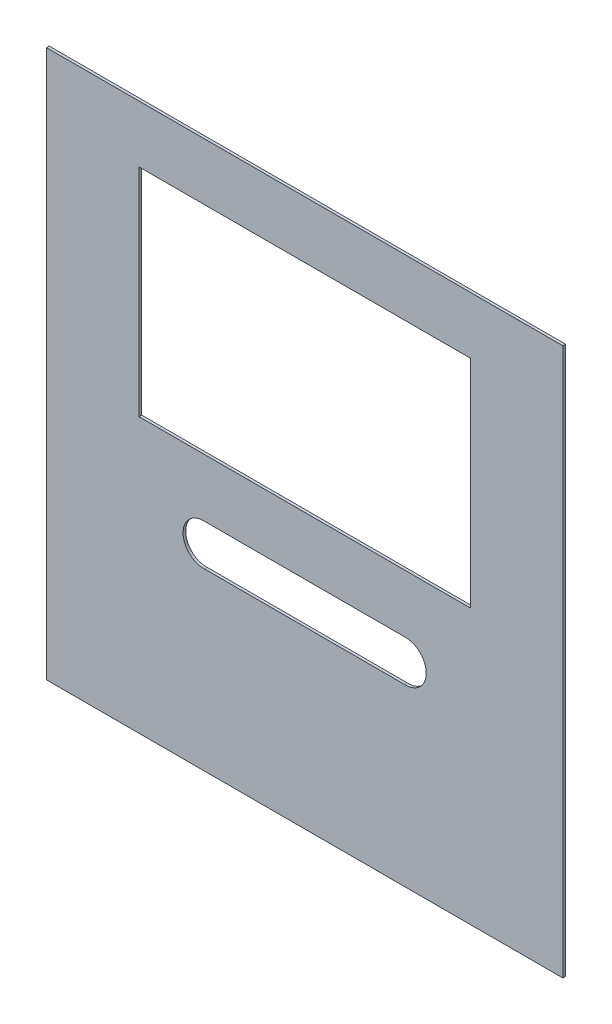
ISO-10303-21;
HEADER;
FILE_DESCRIPTION(('STEP AP214'),'2;1');
FILE_NAME('part.step','',(''),(''),'','','');
FILE_SCHEMA(('AUTOMOTIVE_DESIGN { 1 0 10303 214 1 1 1 1 }'));
ENDSEC;
DATA;
#1=APPLICATION_CONTEXT('core data for automotive mechanical design processes');
#2=APPLICATION_PROTOCOL_DEFINITION('international standard','automotive_design',2000,#1);
#3=PRODUCT_CONTEXT('',#1,'mechanical');
#4=PRODUCT('Part','Part','',(#3));
#5=PRODUCT_RELATED_PRODUCT_CATEGORY('part','',(#4));
#6=PRODUCT_DEFINITION_FORMATION('','',#4);
#7=PRODUCT_DEFINITION_CONTEXT('part definition',#1,'design');
#8=PRODUCT_DEFINITION('design','',#6,#7);
#9=PRODUCT_DEFINITION_SHAPE('','',#8);
#10=(LENGTH_UNIT() NAMED_UNIT(*) SI_UNIT(.MILLI.,.METRE.));
#11=(NAMED_UNIT(*) PLANE_ANGLE_UNIT() SI_UNIT($,.RADIAN.));
#12=(NAMED_UNIT(*) SI_UNIT($,.STERADIAN.) SOLID_ANGLE_UNIT());
#13=UNCERTAINTY_MEASURE_WITH_UNIT(LENGTH_MEASURE(1.E-05),#10,'distance_accuracy_value','');
#14=(GEOMETRIC_REPRESENTATION_CONTEXT(3) GLOBAL_UNCERTAINTY_ASSIGNED_CONTEXT((#13)) GLOBAL_UNIT_ASSIGNED_CONTEXT((#10,
#11,#12)) REPRESENTATION_CONTEXT('',''));
#15=CARTESIAN_POINT('',(0.,0.,0.));
#16=DIRECTION('',(0.,0.,1.));
#17=DIRECTION('',(1.,0.,0.));
#18=AXIS2_PLACEMENT_3D('',#15,#16,#17);
#19=CARTESIAN_POINT('',(0.,0.,0.));
#20=DIRECTION('',(0.,0.,-1.));
#21=DIRECTION('',(-1.,0.,0.));
#22=AXIS2_PLACEMENT_3D('',#19,#20,#21);
#23=PLANE('',#22);
#24=CARTESIAN_POINT('',(74.6725591611366,-35.25,0.));
#25=DIRECTION('',(0.,0.,-1.));
#26=DIRECTION('',(1.,0.,0.));
#27=AXIS2_PLACEMENT_3D('',#24,#25,#26);
#28=CIRCLE('',#27,15.2733808570862);
#29=CARTESIAN_POINT('',(73.8277735045313,-20.,0.));
#30=VERTEX_POINT('',#29);
#31=CARTESIAN_POINT('',(73.8277735045313,-50.5,0.));
#32=VERTEX_POINT('',#31);
#33=EDGE_CURVE('E57',#30,#32,#28,.T.);
#34=ORIENTED_EDGE('',*,*,#33,.F.);
#35=DIRECTION('',(1.,0.,0.));
#36=VECTOR('',#35,1.);
#37=CARTESIAN_POINT('',(73.8277735045313,-20.,0.));
#38=LINE('',#37,#36);
#39=CARTESIAN_POINT('',(-73.8277735045313,-20.,0.));
#40=VERTEX_POINT('',#39);
#41=EDGE_CURVE('E151',#40,#30,#38,.T.);
#42=ORIENTED_EDGE('',*,*,#41,.F.);
#43=CARTESIAN_POINT('',(-74.6725591611366,-35.25,0.));
#44=DIRECTION('',(0.,0.,-1.));
#45=DIRECTION('',(-1.,0.,0.));
#46=AXIS2_PLACEMENT_3D('',#43,#44,#45);
#47=CIRCLE('',#46,15.2733808570862);
#48=CARTESIAN_POINT('',(-73.8277735045313,-50.5,0.));
#49=VERTEX_POINT('',#48);
#50=EDGE_CURVE('E155',#49,#40,#47,.T.);
#51=ORIENTED_EDGE('',*,*,#50,.F.);
#52=DIRECTION('',(-1.,0.,0.));
#53=VECTOR('',#52,1.);
#54=CARTESIAN_POINT('',(73.8277735045313,-50.5,0.));
#55=LINE('',#54,#53);
#56=EDGE_CURVE('E164',#32,#49,#55,.T.);
#57=ORIENTED_EDGE('',*,*,#56,.F.);
#58=EDGE_LOOP('',(#34,#42,#51,#57));
#59=FACE_BOUND('',#58,.T.);
#60=DIRECTION('',(0.,-1.,0.));
#61=VECTOR('',#60,1.);
#62=CARTESIAN_POINT('',(191.,225.,0.));
#63=LINE('',#62,#61);
#64=CARTESIAN_POINT('',(191.,225.,0.));
#65=VERTEX_POINT('',#64);
#66=CARTESIAN_POINT('',(191.,-180.,0.));
#67=VERTEX_POINT('',#66);
#68=EDGE_CURVE('E249',#65,#67,#63,.T.);
#69=ORIENTED_EDGE('',*,*,#68,.T.);
#70=DIRECTION('',(-1.,0.,0.));
#71=VECTOR('',#70,1.);
#72=CARTESIAN_POINT('',(191.,-180.,0.));
#73=LINE('',#72,#71);
#74=CARTESIAN_POINT('',(-191.,-180.,0.));
#75=VERTEX_POINT('',#74);
#76=EDGE_CURVE('E230',#67,#75,#73,.T.);
#77=ORIENTED_EDGE('',*,*,#76,.T.);
#78=DIRECTION('',(0.,1.,0.));
#79=VECTOR('',#78,1.);
#80=CARTESIAN_POINT('',(-191.,-180.,0.));
#81=LINE('',#80,#79);
#82=CARTESIAN_POINT('',(-191.,225.,0.));
#83=VERTEX_POINT('',#82);
#84=EDGE_CURVE('E213',#75,#83,#81,.T.);
#85=ORIENTED_EDGE('',*,*,#84,.T.);
#86=DIRECTION('',(1.,0.,0.));
#87=VECTOR('',#86,1.);
#88=CARTESIAN_POINT('',(-191.,225.,0.));
#89=LINE('',#88,#87);
#90=EDGE_CURVE('E245',#83,#65,#89,.T.);
#91=ORIENTED_EDGE('',*,*,#90,.T.);
#92=EDGE_LOOP('',(#69,#77,#85,#91));
#93=FACE_BOUND('',#92,.T.);
#94=DIRECTION('',(1.,0.,0.));
#95=VECTOR('',#94,1.);
#96=CARTESIAN_POINT('',(-122.5,182.814505171212,0.));
#97=LINE('',#96,#95);
#98=CARTESIAN_POINT('',(-122.5,182.814505171212,0.));
#99=VERTEX_POINT('',#98);
#100=CARTESIAN_POINT('',(122.5,182.814505171212,0.));
#101=VERTEX_POINT('',#100);
#102=EDGE_CURVE('E181',#99,#101,#97,.T.);
#103=ORIENTED_EDGE('',*,*,#102,.F.);
#104=DIRECTION('',(0.,1.,0.));
#105=VECTOR('',#104,1.);
#106=CARTESIAN_POINT('',(-122.5,22.8145051712123,0.));
#107=LINE('',#106,#105);
#108=CARTESIAN_POINT('',(-122.5,22.8145051712123,0.));
#109=VERTEX_POINT('',#108);
#110=EDGE_CURVE('E187',#109,#99,#107,.T.);
#111=ORIENTED_EDGE('',*,*,#110,.F.);
#112=DIRECTION('',(-1.,0.,0.));
#113=VECTOR('',#112,1.);
#114=CARTESIAN_POINT('',(131.110849861601,22.8145051712123,0.));
#115=LINE('',#114,#113);
#116=CARTESIAN_POINT('',(122.5,22.8145051712123,0.));
#117=VERTEX_POINT('',#116);
#118=EDGE_CURVE('E173',#117,#109,#115,.T.);
#119=ORIENTED_EDGE('',*,*,#118,.F.);
#120=DIRECTION('',(0.,-1.,0.));
#121=VECTOR('',#120,1.);
#122=CARTESIAN_POINT('',(122.5,182.814505171212,0.));
#123=LINE('',#122,#121);
#124=EDGE_CURVE('E203',#101,#117,#123,.T.);
#125=ORIENTED_EDGE('',*,*,#124,.F.);
#126=EDGE_LOOP('',(#103,#111,#119,#125));
#127=FACE_BOUND('',#126,.T.);
#128=ADVANCED_FACE('F39',(#59,#93,#127),#23,.T.);
#129=CARTESIAN_POINT('',(-191.,-180.,2.));
#130=DIRECTION('',(-1.,0.,0.));
#131=DIRECTION('',(0.,0.,1.));
#132=AXIS2_PLACEMENT_3D('',#129,#130,#131);
#133=PLANE('',#132);
#134=ORIENTED_EDGE('',*,*,#84,.F.);
#135=DIRECTION('',(0.,0.,-1.));
#136=VECTOR('',#135,1.);
#137=CARTESIAN_POINT('',(-191.,-180.,2.));
#138=LINE('',#137,#136);
#139=CARTESIAN_POINT('',(-191.,-180.,2.));
#140=VERTEX_POINT('',#139);
#141=EDGE_CURVE('E11',#140,#75,#138,.T.);
#142=ORIENTED_EDGE('',*,*,#141,.F.);
#143=DIRECTION('',(0.,1.,0.));
#144=VECTOR('',#143,1.);
#145=CARTESIAN_POINT('',(-191.,-180.,2.));
#146=LINE('',#145,#144);
#147=CARTESIAN_POINT('',(-191.,225.,2.));
#148=VERTEX_POINT('',#147);
#149=EDGE_CURVE('E225',#140,#148,#146,.T.);
#150=ORIENTED_EDGE('',*,*,#149,.T.);
#151=DIRECTION('',(0.,0.,-1.));
#152=VECTOR('',#151,1.);
#153=CARTESIAN_POINT('',(-191.,225.,2.));
#154=LINE('',#153,#152);
#155=EDGE_CURVE('E43',#148,#83,#154,.T.);
#156=ORIENTED_EDGE('',*,*,#155,.T.);
#157=EDGE_LOOP('',(#134,#142,#150,#156));
#158=FACE_BOUND('',#157,.T.);
#159=ADVANCED_FACE('F41',(#158),#133,.T.);
#160=CARTESIAN_POINT('',(191.,-180.,2.));
#161=DIRECTION('',(0.,-1.,0.));
#162=DIRECTION('',(0.,0.,-1.));
#163=AXIS2_PLACEMENT_3D('',#160,#161,#162);
#164=PLANE('',#163);
#165=ORIENTED_EDGE('',*,*,#76,.F.);
#166=DIRECTION('',(0.,0.,-1.));
#167=VECTOR('',#166,1.);
#168=CARTESIAN_POINT('',(191.,-180.,2.));
#169=LINE('',#168,#167);
#170=CARTESIAN_POINT('',(191.,-180.,2.));
#171=VERTEX_POINT('',#170);
#172=EDGE_CURVE('E49',#171,#67,#169,.T.);
#173=ORIENTED_EDGE('',*,*,#172,.F.);
#174=DIRECTION('',(-1.,0.,0.));
#175=VECTOR('',#174,1.);
#176=CARTESIAN_POINT('',(191.,-180.,2.));
#177=LINE('',#176,#175);
#178=EDGE_CURVE('E238',#171,#140,#177,.T.);
#179=ORIENTED_EDGE('',*,*,#178,.T.);
#180=ORIENTED_EDGE('',*,*,#141,.T.);
#181=EDGE_LOOP('',(#165,#173,#179,#180));
#182=FACE_BOUND('',#181,.T.);
#183=ADVANCED_FACE('F272',(#182),#164,.T.);
#184=CARTESIAN_POINT('',(191.,225.,2.));
#185=DIRECTION('',(1.,0.,0.));
#186=DIRECTION('',(0.,0.,-1.));
#187=AXIS2_PLACEMENT_3D('',#184,#185,#186);
#188=PLANE('',#187);
#189=ORIENTED_EDGE('',*,*,#68,.F.);
#190=DIRECTION('',(0.,0.,-1.));
#191=VECTOR('',#190,1.);
#192=CARTESIAN_POINT('',(191.,225.,2.));
#193=LINE('',#192,#191);
#194=CARTESIAN_POINT('',(191.,225.,2.));
#195=VERTEX_POINT('',#194);
#196=EDGE_CURVE('E257',#195,#65,#193,.T.);
#197=ORIENTED_EDGE('',*,*,#196,.F.);
#198=DIRECTION('',(0.,-1.,0.));
#199=VECTOR('',#198,1.);
#200=CARTESIAN_POINT('',(191.,225.,2.));
#201=LINE('',#200,#199);
#202=EDGE_CURVE('E234',#195,#171,#201,.T.);
#203=ORIENTED_EDGE('',*,*,#202,.T.);
#204=ORIENTED_EDGE('',*,*,#172,.T.);
#205=EDGE_LOOP('',(#189,#197,#203,#204));
#206=FACE_BOUND('',#205,.T.);
#207=ADVANCED_FACE('F277',(#206),#188,.T.);
#208=CARTESIAN_POINT('',(-191.,225.,2.));
#209=DIRECTION('',(0.,1.,0.));
#210=DIRECTION('',(0.,0.,1.));
#211=AXIS2_PLACEMENT_3D('',#208,#209,#210);
#212=PLANE('',#211);
#213=ORIENTED_EDGE('',*,*,#90,.F.);
#214=ORIENTED_EDGE('',*,*,#155,.F.);
#215=DIRECTION('',(1.,0.,0.));
#216=VECTOR('',#215,1.);
#217=CARTESIAN_POINT('',(-191.,225.,2.));
#218=LINE('',#217,#216);
#219=EDGE_CURVE('E229',#148,#195,#218,.T.);
#220=ORIENTED_EDGE('',*,*,#219,.T.);
#221=ORIENTED_EDGE('',*,*,#196,.T.);
#222=EDGE_LOOP('',(#213,#214,#220,#221));
#223=FACE_BOUND('',#222,.T.);
#224=ADVANCED_FACE('F267',(#223),#212,.T.);
#225=CARTESIAN_POINT('',(0.,0.,2.));
#226=DIRECTION('',(0.,0.,-1.));
#227=DIRECTION('',(-1.,0.,0.));
#228=AXIS2_PLACEMENT_3D('',#225,#226,#227);
#229=PLANE('',#228);
#230=DIRECTION('',(1.,0.,0.));
#231=VECTOR('',#230,1.);
#232=CARTESIAN_POINT('',(73.8277735045313,-20.,2.));
#233=LINE('',#232,#231);
#234=CARTESIAN_POINT('',(-73.8277735045313,-20.,2.));
#235=VERTEX_POINT('',#234);
#236=CARTESIAN_POINT('',(73.8277735045313,-20.,2.));
#237=VERTEX_POINT('',#236);
#238=EDGE_CURVE('E139',#235,#237,#233,.T.);
#239=ORIENTED_EDGE('',*,*,#238,.T.);
#240=CARTESIAN_POINT('',(74.6725591611366,-35.25,2.));
#241=DIRECTION('',(0.,0.,-1.));
#242=DIRECTION('',(1.,0.,0.));
#243=AXIS2_PLACEMENT_3D('',#240,#241,#242);
#244=CIRCLE('',#243,15.2733808570862);
#245=CARTESIAN_POINT('',(73.8277735045313,-50.5,2.));
#246=VERTEX_POINT('',#245);
#247=EDGE_CURVE('E132',#237,#246,#244,.T.);
#248=ORIENTED_EDGE('',*,*,#247,.T.);
#249=DIRECTION('',(-1.,0.,0.));
#250=VECTOR('',#249,1.);
#251=CARTESIAN_POINT('',(73.8277735045313,-50.5,2.));
#252=LINE('',#251,#250);
#253=CARTESIAN_POINT('',(-73.8277735045313,-50.5,2.));
#254=VERTEX_POINT('',#253);
#255=EDGE_CURVE('E142',#246,#254,#252,.T.);
#256=ORIENTED_EDGE('',*,*,#255,.T.);
#257=CARTESIAN_POINT('',(-74.6725591611366,-35.25,2.));
#258=DIRECTION('',(0.,0.,-1.));
#259=DIRECTION('',(-1.,0.,0.));
#260=AXIS2_PLACEMENT_3D('',#257,#258,#259);
#261=CIRCLE('',#260,15.2733808570862);
#262=EDGE_CURVE('E65',#254,#235,#261,.T.);
#263=ORIENTED_EDGE('',*,*,#262,.T.);
#264=EDGE_LOOP('',(#239,#248,#256,#263));
#265=FACE_BOUND('',#264,.T.);
#266=DIRECTION('',(0.,1.,0.));
#267=VECTOR('',#266,1.);
#268=CARTESIAN_POINT('',(-122.5,22.8145051712123,2.));
#269=LINE('',#268,#267);
#270=CARTESIAN_POINT('',(-122.5,22.8145051712123,2.));
#271=VERTEX_POINT('',#270);
#272=CARTESIAN_POINT('',(-122.5,182.814505171212,2.));
#273=VERTEX_POINT('',#272);
#274=EDGE_CURVE('E195',#271,#273,#269,.T.);
#275=ORIENTED_EDGE('',*,*,#274,.T.);
#276=DIRECTION('',(1.,0.,0.));
#277=VECTOR('',#276,1.);
#278=CARTESIAN_POINT('',(-122.5,182.814505171212,2.));
#279=LINE('',#278,#277);
#280=CARTESIAN_POINT('',(122.5,182.814505171212,2.));
#281=VERTEX_POINT('',#280);
#282=EDGE_CURVE('E182',#273,#281,#279,.T.);
#283=ORIENTED_EDGE('',*,*,#282,.T.);
#284=DIRECTION('',(0.,-1.,0.));
#285=VECTOR('',#284,1.);
#286=CARTESIAN_POINT('',(122.5,182.814505171212,2.));
#287=LINE('',#286,#285);
#288=CARTESIAN_POINT('',(122.5,22.8145051712123,2.));
#289=VERTEX_POINT('',#288);
#290=EDGE_CURVE('E186',#281,#289,#287,.T.);
#291=ORIENTED_EDGE('',*,*,#290,.T.);
#292=DIRECTION('',(-1.,0.,0.));
#293=VECTOR('',#292,1.);
#294=CARTESIAN_POINT('',(122.5,22.8145051712123,2.));
#295=LINE('',#294,#293);
#296=EDGE_CURVE('E191',#289,#271,#295,.T.);
#297=ORIENTED_EDGE('',*,*,#296,.T.);
#298=EDGE_LOOP('',(#275,#283,#291,#297));
#299=FACE_BOUND('',#298,.T.);
#300=ORIENTED_EDGE('',*,*,#149,.F.);
#301=ORIENTED_EDGE('',*,*,#178,.F.);
#302=ORIENTED_EDGE('',*,*,#202,.F.);
#303=ORIENTED_EDGE('',*,*,#219,.F.);
#304=EDGE_LOOP('',(#300,#301,#302,#303));
#305=FACE_BOUND('',#304,.T.);
#306=ADVANCED_FACE('F147',(#265,#299,#305),#229,.F.);
#307=CARTESIAN_POINT('',(131.110849861601,22.8145051712123,0.));
#308=DIRECTION('',(0.,-1.,0.));
#309=DIRECTION('',(0.,0.,-1.));
#310=AXIS2_PLACEMENT_3D('',#307,#308,#309);
#311=PLANE('',#310);
#312=DIRECTION('',(0.,0.,-1.));
#313=VECTOR('',#312,1.);
#314=CARTESIAN_POINT('',(122.5,22.8145051712123,2.));
#315=LINE('',#314,#313);
#316=EDGE_CURVE('E218',#289,#117,#315,.T.);
#317=ORIENTED_EDGE('',*,*,#316,.T.);
#318=ORIENTED_EDGE('',*,*,#118,.T.);
#319=DIRECTION('',(0.,0.,-1.));
#320=VECTOR('',#319,1.);
#321=CARTESIAN_POINT('',(-122.5,22.8145051712123,2.));
#322=LINE('',#321,#320);
#323=EDGE_CURVE('E214',#271,#109,#322,.T.);
#324=ORIENTED_EDGE('',*,*,#323,.F.);
#325=ORIENTED_EDGE('',*,*,#296,.F.);
#326=EDGE_LOOP('',(#317,#318,#324,#325));
#327=FACE_BOUND('',#326,.T.);
#328=ADVANCED_FACE('F294',(#327),#311,.F.);
#329=CARTESIAN_POINT('',(-122.5,182.814505171212,2.));
#330=DIRECTION('',(0.,1.,0.));
#331=DIRECTION('',(-1.,0.,0.));
#332=AXIS2_PLACEMENT_3D('',#329,#330,#331);
#333=PLANE('',#332);
#334=ORIENTED_EDGE('',*,*,#102,.T.);
#335=DIRECTION('',(0.,0.,-1.));
#336=VECTOR('',#335,1.);
#337=CARTESIAN_POINT('',(122.5,182.814505171212,2.));
#338=LINE('',#337,#336);
#339=EDGE_CURVE('E199',#281,#101,#338,.T.);
#340=ORIENTED_EDGE('',*,*,#339,.F.);
#341=ORIENTED_EDGE('',*,*,#282,.F.);
#342=DIRECTION('',(0.,0.,-1.));
#343=VECTOR('',#342,1.);
#344=CARTESIAN_POINT('',(-122.5,182.814505171212,2.));
#345=LINE('',#344,#343);
#346=EDGE_CURVE('E209',#273,#99,#345,.T.);
#347=ORIENTED_EDGE('',*,*,#346,.T.);
#348=EDGE_LOOP('',(#334,#340,#341,#347));
#349=FACE_BOUND('',#348,.T.);
#350=ADVANCED_FACE('F297',(#349),#333,.F.);
#351=CARTESIAN_POINT('',(-122.5,22.8145051712123,2.));
#352=DIRECTION('',(-1.,0.,0.));
#353=DIRECTION('',(0.,0.,1.));
#354=AXIS2_PLACEMENT_3D('',#351,#352,#353);
#355=PLANE('',#354);
#356=ORIENTED_EDGE('',*,*,#110,.T.);
#357=ORIENTED_EDGE('',*,*,#346,.F.);
#358=ORIENTED_EDGE('',*,*,#274,.F.);
#359=ORIENTED_EDGE('',*,*,#323,.T.);
#360=EDGE_LOOP('',(#356,#357,#358,#359));
#361=FACE_BOUND('',#360,.T.);
#362=ADVANCED_FACE('F301',(#361),#355,.F.);
#363=CARTESIAN_POINT('',(122.5,182.814505171212,2.));
#364=DIRECTION('',(1.,0.,0.));
#365=DIRECTION('',(0.,1.,0.));
#366=AXIS2_PLACEMENT_3D('',#363,#364,#365);
#367=PLANE('',#366);
#368=ORIENTED_EDGE('',*,*,#339,.T.);
#369=ORIENTED_EDGE('',*,*,#124,.T.);
#370=ORIENTED_EDGE('',*,*,#316,.F.);
#371=ORIENTED_EDGE('',*,*,#290,.F.);
#372=EDGE_LOOP('',(#368,#369,#370,#371));
#373=FACE_BOUND('',#372,.T.);
#374=ADVANCED_FACE('F303',(#373),#367,.F.);
#375=CARTESIAN_POINT('',(74.6725591611366,-35.25,2.));
#376=DIRECTION('',(0.,0.,-1.));
#377=DIRECTION('',(-1.,0.,0.));
#378=AXIS2_PLACEMENT_3D('',#375,#376,#377);
#379=CYLINDRICAL_SURFACE('',#378,15.2733808570862);
#380=ORIENTED_EDGE('',*,*,#33,.T.);
#381=DIRECTION('',(0.,0.,-1.));
#382=VECTOR('',#381,1.);
#383=CARTESIAN_POINT('',(73.8277735045313,-50.5,2.));
#384=LINE('',#383,#382);
#385=EDGE_CURVE('E128',#246,#32,#384,.T.);
#386=ORIENTED_EDGE('',*,*,#385,.F.);
#387=ORIENTED_EDGE('',*,*,#247,.F.);
#388=DIRECTION('',(0.,0.,-1.));
#389=VECTOR('',#388,1.);
#390=CARTESIAN_POINT('',(73.8277735045313,-20.,2.));
#391=LINE('',#390,#389);
#392=EDGE_CURVE('E170',#237,#30,#391,.T.);
#393=ORIENTED_EDGE('',*,*,#392,.T.);
#394=EDGE_LOOP('',(#380,#386,#387,#393));
#395=FACE_BOUND('',#394,.T.);
#396=ADVANCED_FACE('F130',(#395),#379,.F.);
#397=CARTESIAN_POINT('',(73.8277735045313,-20.,2.));
#398=DIRECTION('',(0.,1.,0.));
#399=DIRECTION('',(-1.,0.,0.));
#400=AXIS2_PLACEMENT_3D('',#397,#398,#399);
#401=PLANE('',#400);
#402=ORIENTED_EDGE('',*,*,#41,.T.);
#403=ORIENTED_EDGE('',*,*,#392,.F.);
#404=ORIENTED_EDGE('',*,*,#238,.F.);
#405=DIRECTION('',(0.,0.,-1.));
#406=VECTOR('',#405,1.);
#407=CARTESIAN_POINT('',(-73.8277735045313,-20.,2.));
#408=LINE('',#407,#406);
#409=EDGE_CURVE('E174',#235,#40,#408,.T.);
#410=ORIENTED_EDGE('',*,*,#409,.T.);
#411=EDGE_LOOP('',(#402,#403,#404,#410));
#412=FACE_BOUND('',#411,.T.);
#413=ADVANCED_FACE('F312',(#412),#401,.F.);
#414=CARTESIAN_POINT('',(-74.6725591611366,-35.25,2.));
#415=DIRECTION('',(0.,0.,-1.));
#416=DIRECTION('',(-1.,0.,0.));
#417=AXIS2_PLACEMENT_3D('',#414,#415,#416);
#418=CYLINDRICAL_SURFACE('',#417,15.2733808570862);
#419=ORIENTED_EDGE('',*,*,#50,.T.);
#420=ORIENTED_EDGE('',*,*,#409,.F.);
#421=ORIENTED_EDGE('',*,*,#262,.F.);
#422=DIRECTION('',(0.,0.,-1.));
#423=VECTOR('',#422,1.);
#424=CARTESIAN_POINT('',(-73.8277735045313,-50.5,2.));
#425=LINE('',#424,#423);
#426=EDGE_CURVE('E138',#254,#49,#425,.T.);
#427=ORIENTED_EDGE('',*,*,#426,.T.);
#428=EDGE_LOOP('',(#419,#420,#421,#427));
#429=FACE_BOUND('',#428,.T.);
#430=ADVANCED_FACE('F315',(#429),#418,.F.);
#431=CARTESIAN_POINT('',(73.8277735045313,-50.5,2.));
#432=DIRECTION('',(0.,-1.,0.));
#433=DIRECTION('',(1.,0.,0.));
#434=AXIS2_PLACEMENT_3D('',#431,#432,#433);
#435=PLANE('',#434);
#436=ORIENTED_EDGE('',*,*,#56,.T.);
#437=ORIENTED_EDGE('',*,*,#426,.F.);
#438=ORIENTED_EDGE('',*,*,#255,.F.);
#439=ORIENTED_EDGE('',*,*,#385,.T.);
#440=EDGE_LOOP('',(#436,#437,#438,#439));
#441=FACE_BOUND('',#440,.T.);
#442=ADVANCED_FACE('F143',(#441),#435,.F.);
#443=CLOSED_SHELL('',(#128,#159,#183,#207,#224,#306,#328,#350,#362,#374,#396,#413,#430,#442));
#444=MANIFOLD_SOLID_BREP('B2',#443);
#445=ADVANCED_BREP_SHAPE_REPRESENTATION('',(#18,#444),#14);
#446=SHAPE_DEFINITION_REPRESENTATION(#9,#445);
ENDSEC;
END-ISO-10303-21;
